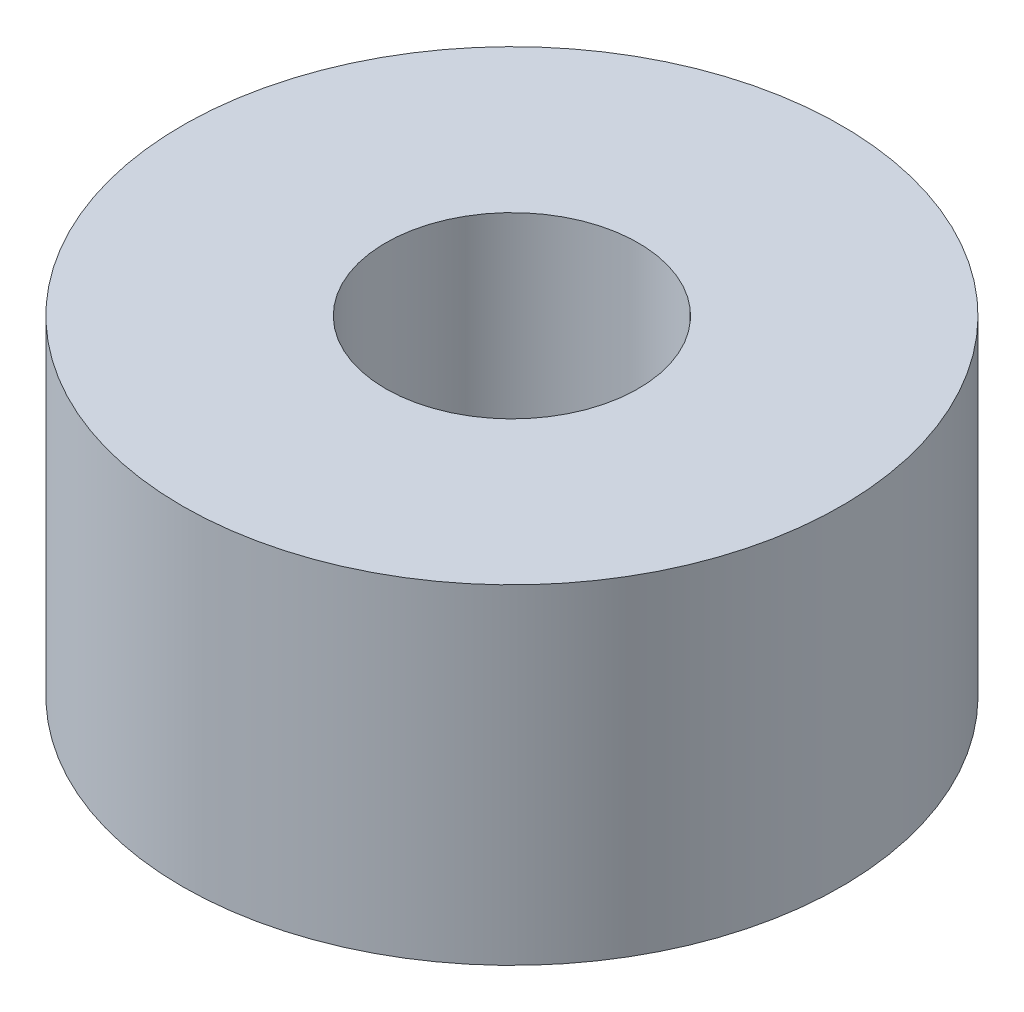
ISO-10303-21;
HEADER;
FILE_DESCRIPTION(('STEP AP214'),'2;1');
FILE_NAME('part.step','',(''),(''),'','','');
FILE_SCHEMA(('AUTOMOTIVE_DESIGN { 1 0 10303 214 1 1 1 1 }'));
ENDSEC;
DATA;
#1=APPLICATION_CONTEXT('core data for automotive mechanical design processes');
#2=APPLICATION_PROTOCOL_DEFINITION('international standard','automotive_design',2000,#1);
#3=PRODUCT_CONTEXT('',#1,'mechanical');
#4=PRODUCT('Part','Part','',(#3));
#5=PRODUCT_RELATED_PRODUCT_CATEGORY('part','',(#4));
#6=PRODUCT_DEFINITION_FORMATION('','',#4);
#7=PRODUCT_DEFINITION_CONTEXT('part definition',#1,'design');
#8=PRODUCT_DEFINITION('design','',#6,#7);
#9=PRODUCT_DEFINITION_SHAPE('','',#8);
#10=(LENGTH_UNIT() NAMED_UNIT(*) SI_UNIT(.MILLI.,.METRE.));
#11=(NAMED_UNIT(*) PLANE_ANGLE_UNIT() SI_UNIT($,.RADIAN.));
#12=(NAMED_UNIT(*) SI_UNIT($,.STERADIAN.) SOLID_ANGLE_UNIT());
#13=UNCERTAINTY_MEASURE_WITH_UNIT(LENGTH_MEASURE(1.E-05),#10,'distance_accuracy_value','');
#14=(GEOMETRIC_REPRESENTATION_CONTEXT(3) GLOBAL_UNCERTAINTY_ASSIGNED_CONTEXT((#13)) GLOBAL_UNIT_ASSIGNED_CONTEXT((#10,
#11,#12)) REPRESENTATION_CONTEXT('',''));
#15=CARTESIAN_POINT('',(0.,0.,0.));
#16=DIRECTION('',(0.,0.,1.));
#17=DIRECTION('',(1.,0.,0.));
#18=AXIS2_PLACEMENT_3D('',#15,#16,#17);
#19=CARTESIAN_POINT('',(0.,3.,0.));
#20=DIRECTION('',(0.,1.,0.));
#21=DIRECTION('',(0.,0.,1.));
#22=AXIS2_PLACEMENT_3D('',#19,#20,#21);
#23=PLANE('',#22);
#24=CARTESIAN_POINT('',(0.,3.,0.));
#25=DIRECTION('',(0.,1.,0.));
#26=DIRECTION('',(0.,0.,1.));
#27=AXIS2_PLACEMENT_3D('',#24,#25,#26);
#28=CIRCLE('',#27,3.);
#29=CARTESIAN_POINT('',(0.,3.,3.));
#30=VERTEX_POINT('',#29);
#31=EDGE_CURVE('E10',#30,#30,#28,.T.);
#32=ORIENTED_EDGE('',*,*,#31,.T.);
#33=EDGE_LOOP('',(#32));
#34=FACE_BOUND('',#33,.T.);
#35=CARTESIAN_POINT('',(0.,3.,0.));
#36=DIRECTION('',(0.,1.,0.));
#37=DIRECTION('',(0.,0.,1.));
#38=AXIS2_PLACEMENT_3D('',#35,#36,#37);
#39=CIRCLE('',#38,1.15);
#40=CARTESIAN_POINT('',(0.,3.,1.15));
#41=VERTEX_POINT('',#40);
#42=EDGE_CURVE('E50',#41,#41,#39,.T.);
#43=ORIENTED_EDGE('',*,*,#42,.F.);
#44=EDGE_LOOP('',(#43));
#45=FACE_BOUND('',#44,.T.);
#46=ADVANCED_FACE('F39',(#34,#45),#23,.T.);
#47=CARTESIAN_POINT('',(0.,0.,0.));
#48=DIRECTION('',(0.,1.,0.));
#49=DIRECTION('',(0.,0.,1.));
#50=AXIS2_PLACEMENT_3D('',#47,#48,#49);
#51=PLANE('',#50);
#52=CARTESIAN_POINT('',(0.,0.,0.));
#53=DIRECTION('',(0.,1.,0.));
#54=DIRECTION('',(0.,0.,1.));
#55=AXIS2_PLACEMENT_3D('',#52,#53,#54);
#56=CIRCLE('',#55,3.);
#57=CARTESIAN_POINT('',(0.,0.,3.));
#58=VERTEX_POINT('',#57);
#59=EDGE_CURVE('E43',#58,#58,#56,.T.);
#60=ORIENTED_EDGE('',*,*,#59,.F.);
#61=EDGE_LOOP('',(#60));
#62=FACE_BOUND('',#61,.T.);
#63=CARTESIAN_POINT('',(0.,0.,0.));
#64=DIRECTION('',(0.,1.,0.));
#65=DIRECTION('',(0.,0.,1.));
#66=AXIS2_PLACEMENT_3D('',#63,#64,#65);
#67=CIRCLE('',#66,1.15);
#68=CARTESIAN_POINT('',(0.,0.,1.15));
#69=VERTEX_POINT('',#68);
#70=EDGE_CURVE('E52',#69,#69,#67,.T.);
#71=ORIENTED_EDGE('',*,*,#70,.T.);
#72=EDGE_LOOP('',(#71));
#73=FACE_BOUND('',#72,.T.);
#74=ADVANCED_FACE('F62',(#62,#73),#51,.F.);
#75=CARTESIAN_POINT('',(0.,3.,0.));
#76=DIRECTION('',(0.,-1.,0.));
#77=DIRECTION('',(0.,0.,-1.));
#78=AXIS2_PLACEMENT_3D('',#75,#76,#77);
#79=CYLINDRICAL_SURFACE('',#78,3.);
#80=ORIENTED_EDGE('',*,*,#31,.F.);
#81=EDGE_LOOP('',(#80));
#82=FACE_BOUND('',#81,.T.);
#83=ORIENTED_EDGE('',*,*,#59,.T.);
#84=EDGE_LOOP('',(#83));
#85=FACE_BOUND('',#84,.T.);
#86=ADVANCED_FACE('F41',(#82,#85),#79,.T.);
#87=CARTESIAN_POINT('',(0.,3.,0.));
#88=DIRECTION('',(0.,-1.,0.));
#89=DIRECTION('',(0.,0.,-1.));
#90=AXIS2_PLACEMENT_3D('',#87,#88,#89);
#91=CYLINDRICAL_SURFACE('',#90,1.15);
#92=ORIENTED_EDGE('',*,*,#42,.T.);
#93=EDGE_LOOP('',(#92));
#94=FACE_BOUND('',#93,.T.);
#95=ORIENTED_EDGE('',*,*,#70,.F.);
#96=EDGE_LOOP('',(#95));
#97=FACE_BOUND('',#96,.T.);
#98=ADVANCED_FACE('F58',(#94,#97),#91,.F.);
#99=CLOSED_SHELL('',(#46,#74,#86,#98));
#100=MANIFOLD_SOLID_BREP('B2',#99);
#101=ADVANCED_BREP_SHAPE_REPRESENTATION('',(#18,#100),#14);
#102=SHAPE_DEFINITION_REPRESENTATION(#9,#101);
ENDSEC;
END-ISO-10303-21;
